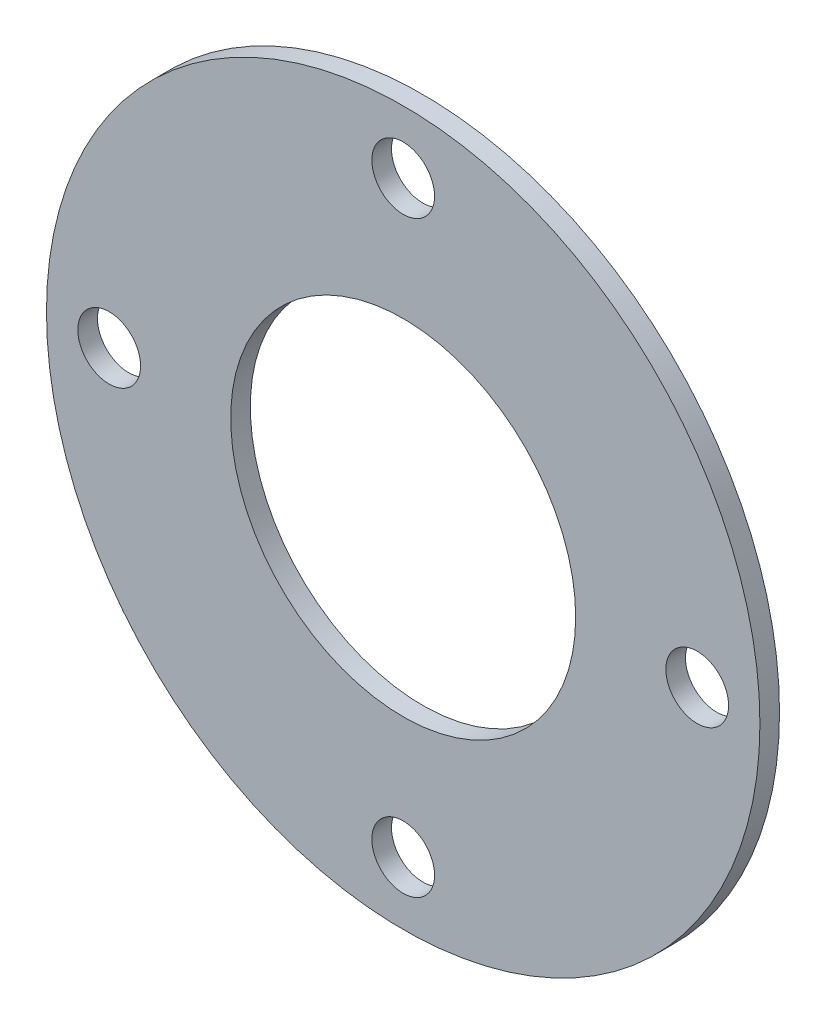
ISO-10303-21;
HEADER;
FILE_DESCRIPTION(('STEP AP214'),'2;1');
FILE_NAME('part.step','',(''),(''),'','','');
FILE_SCHEMA(('AUTOMOTIVE_DESIGN { 1 0 10303 214 1 1 1 1 }'));
ENDSEC;
DATA;
#1=APPLICATION_CONTEXT('core data for automotive mechanical design processes');
#2=APPLICATION_PROTOCOL_DEFINITION('international standard','automotive_design',2000,#1);
#3=PRODUCT_CONTEXT('',#1,'mechanical');
#4=PRODUCT('Part','Part','',(#3));
#5=PRODUCT_RELATED_PRODUCT_CATEGORY('part','',(#4));
#6=PRODUCT_DEFINITION_FORMATION('','',#4);
#7=PRODUCT_DEFINITION_CONTEXT('part definition',#1,'design');
#8=PRODUCT_DEFINITION('design','',#6,#7);
#9=PRODUCT_DEFINITION_SHAPE('','',#8);
#10=(LENGTH_UNIT() NAMED_UNIT(*) SI_UNIT(.MILLI.,.METRE.));
#11=(NAMED_UNIT(*) PLANE_ANGLE_UNIT() SI_UNIT($,.RADIAN.));
#12=(NAMED_UNIT(*) SI_UNIT($,.STERADIAN.) SOLID_ANGLE_UNIT());
#13=UNCERTAINTY_MEASURE_WITH_UNIT(LENGTH_MEASURE(1.E-05),#10,'distance_accuracy_value','');
#14=(GEOMETRIC_REPRESENTATION_CONTEXT(3) GLOBAL_UNCERTAINTY_ASSIGNED_CONTEXT((#13)) GLOBAL_UNIT_ASSIGNED_CONTEXT((#10,
#11,#12)) REPRESENTATION_CONTEXT('',''));
#15=CARTESIAN_POINT('',(0.,0.,0.));
#16=DIRECTION('',(0.,0.,1.));
#17=DIRECTION('',(1.,0.,0.));
#18=AXIS2_PLACEMENT_3D('',#15,#16,#17);
#19=CARTESIAN_POINT('',(0.,0.,34.5));
#20=DIRECTION('',(0.,0.,1.));
#21=DIRECTION('',(1.,0.,0.));
#22=AXIS2_PLACEMENT_3D('',#19,#20,#21);
#23=PLANE('',#22);
#24=CARTESIAN_POINT('',(37.5,0.,34.5));
#25=DIRECTION('',(0.,0.,1.));
#26=DIRECTION('',(1.,0.,0.));
#27=AXIS2_PLACEMENT_3D('',#24,#25,#26);
#28=CIRCLE('',#27,4.);
#29=CARTESIAN_POINT('',(41.5,0.,34.5));
#30=VERTEX_POINT('',#29);
#31=EDGE_CURVE('E85',#30,#30,#28,.T.);
#32=ORIENTED_EDGE('',*,*,#31,.F.);
#33=EDGE_LOOP('',(#32));
#34=FACE_BOUND('',#33,.T.);
#35=CARTESIAN_POINT('',(0.,37.5,34.5));
#36=DIRECTION('',(0.,0.,1.));
#37=DIRECTION('',(1.,0.,0.));
#38=AXIS2_PLACEMENT_3D('',#35,#36,#37);
#39=CIRCLE('',#38,4.);
#40=CARTESIAN_POINT('',(4.,37.5,34.5));
#41=VERTEX_POINT('',#40);
#42=EDGE_CURVE('E71',#41,#41,#39,.T.);
#43=ORIENTED_EDGE('',*,*,#42,.F.);
#44=EDGE_LOOP('',(#43));
#45=FACE_BOUND('',#44,.T.);
#46=CARTESIAN_POINT('',(-37.5,0.,34.5));
#47=DIRECTION('',(0.,0.,1.));
#48=DIRECTION('',(1.,0.,0.));
#49=AXIS2_PLACEMENT_3D('',#46,#47,#48);
#50=CIRCLE('',#49,4.);
#51=CARTESIAN_POINT('',(-33.5,0.,34.5));
#52=VERTEX_POINT('',#51);
#53=EDGE_CURVE('E67',#52,#52,#50,.T.);
#54=ORIENTED_EDGE('',*,*,#53,.F.);
#55=EDGE_LOOP('',(#54));
#56=FACE_BOUND('',#55,.T.);
#57=CARTESIAN_POINT('',(0.,-37.5,34.5));
#58=DIRECTION('',(0.,0.,1.));
#59=DIRECTION('',(1.,0.,0.));
#60=AXIS2_PLACEMENT_3D('',#57,#58,#59);
#61=CIRCLE('',#60,4.);
#62=CARTESIAN_POINT('',(3.99999999999999,-37.5,34.5));
#63=VERTEX_POINT('',#62);
#64=EDGE_CURVE('E63',#63,#63,#61,.T.);
#65=ORIENTED_EDGE('',*,*,#64,.F.);
#66=EDGE_LOOP('',(#65));
#67=FACE_BOUND('',#66,.T.);
#68=CARTESIAN_POINT('',(0.,0.,34.5));
#69=DIRECTION('',(0.,0.,1.));
#70=DIRECTION('',(1.,0.,0.));
#71=AXIS2_PLACEMENT_3D('',#68,#69,#70);
#72=CIRCLE('',#71,45.5);
#73=CARTESIAN_POINT('',(45.5,0.,34.5));
#74=VERTEX_POINT('',#73);
#75=EDGE_CURVE('E10',#74,#74,#72,.T.);
#76=ORIENTED_EDGE('',*,*,#75,.T.);
#77=EDGE_LOOP('',(#76));
#78=FACE_BOUND('',#77,.T.);
#79=CARTESIAN_POINT('',(0.,0.,34.5));
#80=DIRECTION('',(0.,0.,1.));
#81=DIRECTION('',(1.,0.,0.));
#82=AXIS2_PLACEMENT_3D('',#79,#80,#81);
#83=CIRCLE('',#82,22.);
#84=CARTESIAN_POINT('',(22.,0.,34.5));
#85=VERTEX_POINT('',#84);
#86=EDGE_CURVE('E53',#85,#85,#83,.T.);
#87=ORIENTED_EDGE('',*,*,#86,.F.);
#88=EDGE_LOOP('',(#87));
#89=FACE_BOUND('',#88,.T.);
#90=ADVANCED_FACE('F36',(#34,#45,#56,#67,#78,#89),#23,.T.);
#91=CARTESIAN_POINT('',(0.,0.,32.));
#92=DIRECTION('',(0.,0.,1.));
#93=DIRECTION('',(1.,0.,0.));
#94=AXIS2_PLACEMENT_3D('',#91,#92,#93);
#95=PLANE('',#94);
#96=CARTESIAN_POINT('',(37.5,0.,32.));
#97=DIRECTION('',(0.,0.,1.));
#98=DIRECTION('',(1.,0.,0.));
#99=AXIS2_PLACEMENT_3D('',#96,#97,#98);
#100=CIRCLE('',#99,4.);
#101=CARTESIAN_POINT('',(41.5,0.,32.));
#102=VERTEX_POINT('',#101);
#103=EDGE_CURVE('E40',#102,#102,#100,.T.);
#104=ORIENTED_EDGE('',*,*,#103,.T.);
#105=EDGE_LOOP('',(#104));
#106=FACE_BOUND('',#105,.T.);
#107=CARTESIAN_POINT('',(0.,37.5,32.));
#108=DIRECTION('',(0.,0.,1.));
#109=DIRECTION('',(1.,0.,0.));
#110=AXIS2_PLACEMENT_3D('',#107,#108,#109);
#111=CIRCLE('',#110,4.);
#112=CARTESIAN_POINT('',(4.,37.5,32.));
#113=VERTEX_POINT('',#112);
#114=EDGE_CURVE('E68',#113,#113,#111,.T.);
#115=ORIENTED_EDGE('',*,*,#114,.T.);
#116=EDGE_LOOP('',(#115));
#117=FACE_BOUND('',#116,.T.);
#118=CARTESIAN_POINT('',(-37.5,0.,32.));
#119=DIRECTION('',(0.,0.,1.));
#120=DIRECTION('',(1.,0.,0.));
#121=AXIS2_PLACEMENT_3D('',#118,#119,#120);
#122=CIRCLE('',#121,4.);
#123=CARTESIAN_POINT('',(-33.5,0.,32.));
#124=VERTEX_POINT('',#123);
#125=EDGE_CURVE('E64',#124,#124,#122,.T.);
#126=ORIENTED_EDGE('',*,*,#125,.T.);
#127=EDGE_LOOP('',(#126));
#128=FACE_BOUND('',#127,.T.);
#129=CARTESIAN_POINT('',(0.,-37.5,32.));
#130=DIRECTION('',(0.,0.,1.));
#131=DIRECTION('',(1.,0.,0.));
#132=AXIS2_PLACEMENT_3D('',#129,#130,#131);
#133=CIRCLE('',#132,4.);
#134=CARTESIAN_POINT('',(3.99999999999999,-37.5,32.));
#135=VERTEX_POINT('',#134);
#136=EDGE_CURVE('E59',#135,#135,#133,.T.);
#137=ORIENTED_EDGE('',*,*,#136,.T.);
#138=EDGE_LOOP('',(#137));
#139=FACE_BOUND('',#138,.T.);
#140=CARTESIAN_POINT('',(0.,0.,32.));
#141=DIRECTION('',(0.,0.,1.));
#142=DIRECTION('',(1.,0.,0.));
#143=AXIS2_PLACEMENT_3D('',#140,#141,#142);
#144=CIRCLE('',#143,45.5);
#145=CARTESIAN_POINT('',(45.5,0.,32.));
#146=VERTEX_POINT('',#145);
#147=EDGE_CURVE('E45',#146,#146,#144,.T.);
#148=ORIENTED_EDGE('',*,*,#147,.F.);
#149=EDGE_LOOP('',(#148));
#150=FACE_BOUND('',#149,.T.);
#151=CARTESIAN_POINT('',(0.,0.,32.));
#152=DIRECTION('',(0.,0.,1.));
#153=DIRECTION('',(1.,0.,0.));
#154=AXIS2_PLACEMENT_3D('',#151,#152,#153);
#155=CIRCLE('',#154,22.);
#156=CARTESIAN_POINT('',(22.,0.,32.));
#157=VERTEX_POINT('',#156);
#158=EDGE_CURVE('E56',#157,#157,#155,.T.);
#159=ORIENTED_EDGE('',*,*,#158,.T.);
#160=EDGE_LOOP('',(#159));
#161=FACE_BOUND('',#160,.T.);
#162=ADVANCED_FACE('F94',(#106,#117,#128,#139,#150,#161),#95,.F.);
#163=CARTESIAN_POINT('',(0.,0.,34.5));
#164=DIRECTION('',(0.,0.,-1.));
#165=DIRECTION('',(-1.,0.,0.));
#166=AXIS2_PLACEMENT_3D('',#163,#164,#165);
#167=CYLINDRICAL_SURFACE('',#166,45.5);
#168=ORIENTED_EDGE('',*,*,#75,.F.);
#169=EDGE_LOOP('',(#168));
#170=FACE_BOUND('',#169,.T.);
#171=ORIENTED_EDGE('',*,*,#147,.T.);
#172=EDGE_LOOP('',(#171));
#173=FACE_BOUND('',#172,.T.);
#174=ADVANCED_FACE('F38',(#170,#173),#167,.T.);
#175=CARTESIAN_POINT('',(0.,0.,34.5));
#176=DIRECTION('',(0.,0.,-1.));
#177=DIRECTION('',(-1.,0.,0.));
#178=AXIS2_PLACEMENT_3D('',#175,#176,#177);
#179=CYLINDRICAL_SURFACE('',#178,22.);
#180=ORIENTED_EDGE('',*,*,#86,.T.);
#181=EDGE_LOOP('',(#180));
#182=FACE_BOUND('',#181,.T.);
#183=ORIENTED_EDGE('',*,*,#158,.F.);
#184=EDGE_LOOP('',(#183));
#185=FACE_BOUND('',#184,.T.);
#186=ADVANCED_FACE('F96',(#182,#185),#179,.F.);
#187=CARTESIAN_POINT('',(0.,-37.5,-100.));
#188=DIRECTION('',(0.,0.,1.));
#189=DIRECTION('',(1.,0.,0.));
#190=AXIS2_PLACEMENT_3D('',#187,#188,#189);
#191=CYLINDRICAL_SURFACE('',#190,4.);
#192=ORIENTED_EDGE('',*,*,#64,.T.);
#193=EDGE_LOOP('',(#192));
#194=FACE_BOUND('',#193,.T.);
#195=ORIENTED_EDGE('',*,*,#136,.F.);
#196=EDGE_LOOP('',(#195));
#197=FACE_BOUND('',#196,.T.);
#198=ADVANCED_FACE('F98',(#194,#197),#191,.F.);
#199=CARTESIAN_POINT('',(-37.5,0.,-100.));
#200=DIRECTION('',(0.,0.,1.));
#201=DIRECTION('',(1.,0.,0.));
#202=AXIS2_PLACEMENT_3D('',#199,#200,#201);
#203=CYLINDRICAL_SURFACE('',#202,4.);
#204=ORIENTED_EDGE('',*,*,#53,.T.);
#205=EDGE_LOOP('',(#204));
#206=FACE_BOUND('',#205,.T.);
#207=ORIENTED_EDGE('',*,*,#125,.F.);
#208=EDGE_LOOP('',(#207));
#209=FACE_BOUND('',#208,.T.);
#210=ADVANCED_FACE('F104',(#206,#209),#203,.F.);
#211=CARTESIAN_POINT('',(0.,37.5,-100.));
#212=DIRECTION('',(0.,0.,1.));
#213=DIRECTION('',(1.,0.,0.));
#214=AXIS2_PLACEMENT_3D('',#211,#212,#213);
#215=CYLINDRICAL_SURFACE('',#214,4.);
#216=ORIENTED_EDGE('',*,*,#42,.T.);
#217=EDGE_LOOP('',(#216));
#218=FACE_BOUND('',#217,.T.);
#219=ORIENTED_EDGE('',*,*,#114,.F.);
#220=EDGE_LOOP('',(#219));
#221=FACE_BOUND('',#220,.T.);
#222=ADVANCED_FACE('F130',(#218,#221),#215,.F.);
#223=CARTESIAN_POINT('',(37.5,0.,-100.));
#224=DIRECTION('',(0.,0.,1.));
#225=DIRECTION('',(1.,0.,0.));
#226=AXIS2_PLACEMENT_3D('',#223,#224,#225);
#227=CYLINDRICAL_SURFACE('',#226,4.);
#228=ORIENTED_EDGE('',*,*,#31,.T.);
#229=EDGE_LOOP('',(#228));
#230=FACE_BOUND('',#229,.T.);
#231=ORIENTED_EDGE('',*,*,#103,.F.);
#232=EDGE_LOOP('',(#231));
#233=FACE_BOUND('',#232,.T.);
#234=ADVANCED_FACE('F133',(#230,#233),#227,.F.);
#235=CLOSED_SHELL('',(#90,#162,#174,#186,#198,#210,#222,#234));
#236=MANIFOLD_SOLID_BREP('B2',#235);
#237=ADVANCED_BREP_SHAPE_REPRESENTATION('',(#18,#236),#14);
#238=SHAPE_DEFINITION_REPRESENTATION(#9,#237);
ENDSEC;
END-ISO-10303-21;
